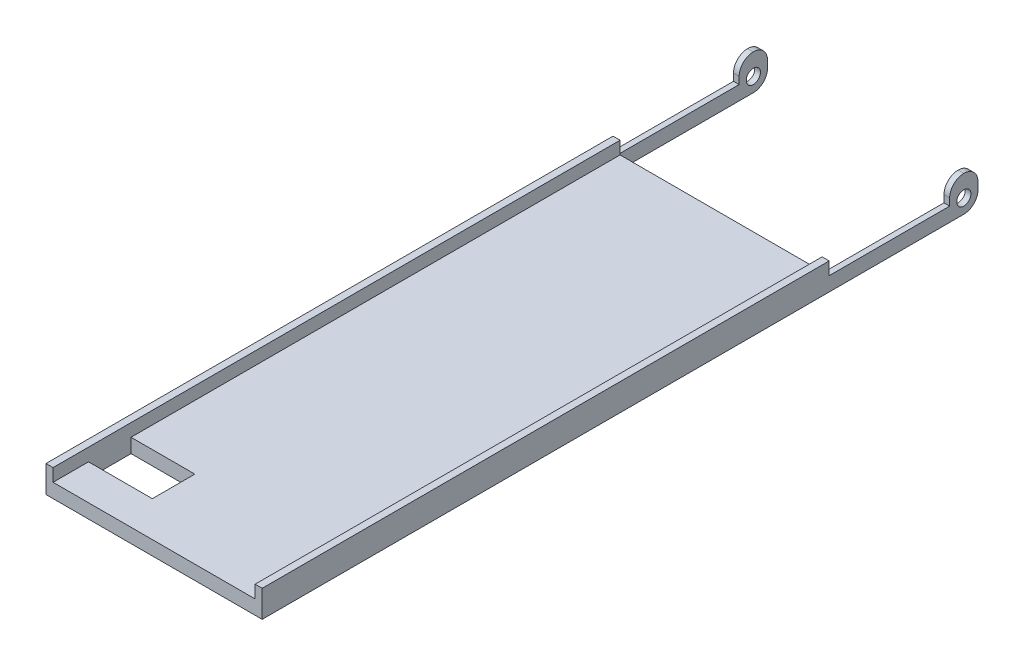
ISO-10303-21;
HEADER;
FILE_DESCRIPTION(('STEP AP214'),'2;1');
FILE_NAME('part.step','',(''),(''),'','','');
FILE_SCHEMA(('AUTOMOTIVE_DESIGN { 1 0 10303 214 1 1 1 1 }'));
ENDSEC;
DATA;
#1=APPLICATION_CONTEXT('core data for automotive mechanical design processes');
#2=APPLICATION_PROTOCOL_DEFINITION('international standard','automotive_design',2000,#1);
#3=PRODUCT_CONTEXT('',#1,'mechanical');
#4=PRODUCT('Part','Part','',(#3));
#5=PRODUCT_RELATED_PRODUCT_CATEGORY('part','',(#4));
#6=PRODUCT_DEFINITION_FORMATION('','',#4);
#7=PRODUCT_DEFINITION_CONTEXT('part definition',#1,'design');
#8=PRODUCT_DEFINITION('design','',#6,#7);
#9=PRODUCT_DEFINITION_SHAPE('','',#8);
#10=(LENGTH_UNIT() NAMED_UNIT(*) SI_UNIT(.MILLI.,.METRE.));
#11=(NAMED_UNIT(*) PLANE_ANGLE_UNIT() SI_UNIT($,.RADIAN.));
#12=(NAMED_UNIT(*) SI_UNIT($,.STERADIAN.) SOLID_ANGLE_UNIT());
#13=UNCERTAINTY_MEASURE_WITH_UNIT(LENGTH_MEASURE(1.E-05),#10,'distance_accuracy_value','');
#14=(GEOMETRIC_REPRESENTATION_CONTEXT(3) GLOBAL_UNCERTAINTY_ASSIGNED_CONTEXT((#13)) GLOBAL_UNIT_ASSIGNED_CONTEXT((#10,
#11,#12)) REPRESENTATION_CONTEXT('',''));
#15=CARTESIAN_POINT('',(0.,0.,0.));
#16=DIRECTION('',(0.,0.,1.));
#17=DIRECTION('',(1.,0.,0.));
#18=AXIS2_PLACEMENT_3D('',#15,#16,#17);
#19=CARTESIAN_POINT('',(0.,2.,0.));
#20=DIRECTION('',(0.,1.,0.));
#21=DIRECTION('',(0.,0.,1.));
#22=AXIS2_PLACEMENT_3D('',#19,#20,#21);
#23=PLANE('',#22);
#24=DIRECTION('',(0.,0.,-1.));
#25=VECTOR('',#24,1.);
#26=CARTESIAN_POINT('',(14.45,2.,-42.5));
#27=LINE('',#26,#25);
#28=CARTESIAN_POINT('',(14.45,2.,-21.5));
#29=VERTEX_POINT('',#28);
#30=CARTESIAN_POINT('',(14.45,2.,-38.5));
#31=VERTEX_POINT('',#30);
#32=EDGE_CURVE('E396',#29,#31,#27,.T.);
#33=ORIENTED_EDGE('',*,*,#32,.F.);
#34=DIRECTION('',(-1.,0.,0.));
#35=VECTOR('',#34,1.);
#36=CARTESIAN_POINT('',(15.25,2.,-21.5));
#37=LINE('',#36,#35);
#38=CARTESIAN_POINT('',(15.25,2.,-21.5));
#39=VERTEX_POINT('',#38);
#40=EDGE_CURVE('E321',#39,#29,#37,.T.);
#41=ORIENTED_EDGE('',*,*,#40,.F.);
#42=DIRECTION('',(0.,0.,-1.));
#43=VECTOR('',#42,1.);
#44=CARTESIAN_POINT('',(15.25,2.,42.5));
#45=LINE('',#44,#43);
#46=CARTESIAN_POINT('',(15.25,2.,-38.5));
#47=VERTEX_POINT('',#46);
#48=EDGE_CURVE('E419',#39,#47,#45,.T.);
#49=ORIENTED_EDGE('',*,*,#48,.T.);
#50=DIRECTION('',(1.,0.,0.));
#51=VECTOR('',#50,1.);
#52=CARTESIAN_POINT('',(14.45,2.,-38.5));
#53=LINE('',#52,#51);
#54=EDGE_CURVE('E361',#31,#47,#53,.T.);
#55=ORIENTED_EDGE('',*,*,#54,.F.);
#56=EDGE_LOOP('',(#33,#41,#49,#55));
#57=FACE_BOUND('',#56,.T.);
#58=ADVANCED_FACE('F45',(#57),#23,.T.);
#59=DIRECTION('',(-1.,0.,0.));
#60=VECTOR('',#59,1.);
#61=CARTESIAN_POINT('',(-14.25,2.,47.5));
#62=LINE('',#61,#60);
#63=CARTESIAN_POINT('',(-5.24999999999999,2.,47.5));
#64=VERTEX_POINT('',#63);
#65=CARTESIAN_POINT('',(-14.25,2.,47.5));
#66=VERTEX_POINT('',#65);
#67=EDGE_CURVE('E70',#64,#66,#62,.T.);
#68=ORIENTED_EDGE('',*,*,#67,.F.);
#69=DIRECTION('',(0.,0.,-1.));
#70=VECTOR('',#69,1.);
#71=CARTESIAN_POINT('',(-5.24999999999999,2.,53.5));
#72=LINE('',#71,#70);
#73=CARTESIAN_POINT('',(-5.24999999999999,2.,53.5));
#74=VERTEX_POINT('',#73);
#75=EDGE_CURVE('E247',#74,#64,#72,.T.);
#76=ORIENTED_EDGE('',*,*,#75,.F.);
#77=DIRECTION('',(1.,0.,0.));
#78=VECTOR('',#77,1.);
#79=CARTESIAN_POINT('',(-14.25,2.,53.5));
#80=LINE('',#79,#78);
#81=CARTESIAN_POINT('',(-14.25,2.,53.5));
#82=VERTEX_POINT('',#81);
#83=EDGE_CURVE('E254',#82,#74,#80,.T.);
#84=ORIENTED_EDGE('',*,*,#83,.F.);
#85=DIRECTION('',(0.,0.,1.));
#86=VECTOR('',#85,1.);
#87=CARTESIAN_POINT('',(-14.25,2.,-21.5));
#88=LINE('',#87,#86);
#89=CARTESIAN_POINT('',(-14.25,2.,58.5));
#90=VERTEX_POINT('',#89);
#91=EDGE_CURVE('E227',#82,#90,#88,.T.);
#92=ORIENTED_EDGE('',*,*,#91,.T.);
#93=DIRECTION('',(1.,0.,0.));
#94=VECTOR('',#93,1.);
#95=CARTESIAN_POINT('',(-14.25,2.,58.5));
#96=LINE('',#95,#94);
#97=CARTESIAN_POINT('',(14.25,2.,58.5));
#98=VERTEX_POINT('',#97);
#99=EDGE_CURVE('E288',#90,#98,#96,.T.);
#100=ORIENTED_EDGE('',*,*,#99,.T.);
#101=DIRECTION('',(0.,0.,-1.));
#102=VECTOR('',#101,1.);
#103=CARTESIAN_POINT('',(14.25,2.,-21.5));
#104=LINE('',#103,#102);
#105=CARTESIAN_POINT('',(14.25,2.,-21.5));
#106=VERTEX_POINT('',#105);
#107=EDGE_CURVE('E292',#98,#106,#104,.T.);
#108=ORIENTED_EDGE('',*,*,#107,.T.);
#109=DIRECTION('',(1.,0.,0.));
#110=VECTOR('',#109,1.);
#111=CARTESIAN_POINT('',(14.45,2.,-21.5));
#112=LINE('',#111,#110);
#113=CARTESIAN_POINT('',(-14.25,2.,-21.5));
#114=VERTEX_POINT('',#113);
#115=EDGE_CURVE('E280',#114,#106,#112,.T.);
#116=ORIENTED_EDGE('',*,*,#115,.F.);
#117=EDGE_CURVE('E284',#114,#66,#88,.T.);
#118=ORIENTED_EDGE('',*,*,#117,.T.);
#119=EDGE_LOOP('',(#68,#76,#84,#92,#100,#108,#116,#118));
#120=FACE_BOUND('',#119,.T.);
#121=ADVANCED_FACE('F591',(#120),#23,.T.);
#122=CARTESIAN_POINT('',(0.,3.8,0.));
#123=DIRECTION('',(0.,1.,0.));
#124=DIRECTION('',(0.,0.,1.));
#125=AXIS2_PLACEMENT_3D('',#122,#123,#124);
#126=PLANE('',#125);
#127=DIRECTION('',(0.,0.,1.));
#128=VECTOR('',#127,1.);
#129=CARTESIAN_POINT('',(-14.25,3.8,-21.5));
#130=LINE('',#129,#128);
#131=CARTESIAN_POINT('',(-14.25,3.8,-21.5));
#132=VERTEX_POINT('',#131);
#133=CARTESIAN_POINT('',(-14.25,3.8,58.5));
#134=VERTEX_POINT('',#133);
#135=EDGE_CURVE('E283',#132,#134,#130,.T.);
#136=ORIENTED_EDGE('',*,*,#135,.F.);
#137=DIRECTION('',(-1.,0.,0.));
#138=VECTOR('',#137,1.);
#139=CARTESIAN_POINT('',(15.25,3.8,-21.5));
#140=LINE('',#139,#138);
#141=CARTESIAN_POINT('',(-15.25,3.8,-21.5));
#142=VERTEX_POINT('',#141);
#143=EDGE_CURVE('E320',#132,#142,#140,.T.);
#144=ORIENTED_EDGE('',*,*,#143,.T.);
#145=DIRECTION('',(0.,0.,1.));
#146=VECTOR('',#145,1.);
#147=CARTESIAN_POINT('',(-15.25,3.8,58.5));
#148=LINE('',#147,#146);
#149=CARTESIAN_POINT('',(-15.25,3.8,58.5));
#150=VERTEX_POINT('',#149);
#151=EDGE_CURVE('E326',#142,#150,#148,.T.);
#152=ORIENTED_EDGE('',*,*,#151,.T.);
#153=DIRECTION('',(1.,0.,0.));
#154=VECTOR('',#153,1.);
#155=CARTESIAN_POINT('',(15.25,3.8,58.5));
#156=LINE('',#155,#154);
#157=EDGE_CURVE('E331',#150,#134,#156,.T.);
#158=ORIENTED_EDGE('',*,*,#157,.T.);
#159=EDGE_LOOP('',(#136,#144,#152,#158));
#160=FACE_BOUND('',#159,.T.);
#161=ADVANCED_FACE('F602',(#160),#126,.T.);
#162=CARTESIAN_POINT('',(-14.45,2.,-21.5));
#163=VERTEX_POINT('',#162);
#164=CARTESIAN_POINT('',(-15.25,2.,-21.5));
#165=VERTEX_POINT('',#164);
#166=EDGE_CURVE('E305',#163,#165,#37,.T.);
#167=ORIENTED_EDGE('',*,*,#166,.F.);
#168=DIRECTION('',(0.,0.,1.));
#169=VECTOR('',#168,1.);
#170=CARTESIAN_POINT('',(-14.45,2.,-24.5));
#171=LINE('',#170,#169);
#172=CARTESIAN_POINT('',(-14.45,2.,-38.5));
#173=VERTEX_POINT('',#172);
#174=EDGE_CURVE('E402',#173,#163,#171,.T.);
#175=ORIENTED_EDGE('',*,*,#174,.F.);
#176=DIRECTION('',(-1.,0.,0.));
#177=VECTOR('',#176,1.);
#178=CARTESIAN_POINT('',(-14.45,2.,-38.5));
#179=LINE('',#178,#177);
#180=CARTESIAN_POINT('',(-15.25,2.,-38.5));
#181=VERTEX_POINT('',#180);
#182=EDGE_CURVE('E382',#173,#181,#179,.T.);
#183=ORIENTED_EDGE('',*,*,#182,.T.);
#184=DIRECTION('',(0.,0.,-1.));
#185=VECTOR('',#184,1.);
#186=CARTESIAN_POINT('',(-15.25,2.,42.5));
#187=LINE('',#186,#185);
#188=EDGE_CURVE('E422',#165,#181,#187,.T.);
#189=ORIENTED_EDGE('',*,*,#188,.F.);
#190=EDGE_LOOP('',(#167,#175,#183,#189));
#191=FACE_BOUND('',#190,.T.);
#192=ADVANCED_FACE('F585',(#191),#23,.T.);
#193=CARTESIAN_POINT('',(-15.25,2.,-42.5));
#194=DIRECTION('',(0.,0.,-1.));
#195=DIRECTION('',(-1.,0.,0.));
#196=AXIS2_PLACEMENT_3D('',#193,#194,#195);
#197=PLANE('',#196);
#198=DIRECTION('',(0.,1.,0.));
#199=VECTOR('',#198,1.);
#200=CARTESIAN_POINT('',(-14.45,0.,-42.5));
#201=LINE('',#200,#199);
#202=CARTESIAN_POINT('',(-14.45,2.,-42.5));
#203=VERTEX_POINT('',#202);
#204=CARTESIAN_POINT('',(-14.45,3.,-42.5));
#205=VERTEX_POINT('',#204);
#206=EDGE_CURVE('E411',#203,#205,#201,.T.);
#207=ORIENTED_EDGE('',*,*,#206,.F.);
#208=DIRECTION('',(1.,0.,0.));
#209=VECTOR('',#208,1.);
#210=CARTESIAN_POINT('',(-15.25,2.,-42.5));
#211=LINE('',#210,#209);
#212=CARTESIAN_POINT('',(-15.25,2.,-42.5));
#213=VERTEX_POINT('',#212);
#214=EDGE_CURVE('E457',#203,#213,#211,.F.);
#215=ORIENTED_EDGE('',*,*,#214,.T.);
#216=DIRECTION('',(0.,-1.,0.));
#217=VECTOR('',#216,1.);
#218=CARTESIAN_POINT('',(-15.25,2.,-42.5));
#219=LINE('',#218,#217);
#220=CARTESIAN_POINT('',(-15.25,3.,-42.5));
#221=VERTEX_POINT('',#220);
#222=EDGE_CURVE('E426',#221,#213,#219,.T.);
#223=ORIENTED_EDGE('',*,*,#222,.F.);
#224=DIRECTION('',(-1.,0.,0.));
#225=VECTOR('',#224,1.);
#226=CARTESIAN_POINT('',(-15.25,3.,-42.5));
#227=LINE('',#226,#225);
#228=EDGE_CURVE('E453',#221,#205,#227,.F.);
#229=ORIENTED_EDGE('',*,*,#228,.T.);
#230=EDGE_LOOP('',(#207,#215,#223,#229));
#231=FACE_BOUND('',#230,.T.);
#232=ADVANCED_FACE('F562',(#231),#197,.T.);
#233=CARTESIAN_POINT('',(15.25,2.,42.5));
#234=DIRECTION('',(-1.,0.,0.));
#235=DIRECTION('',(0.,0.,1.));
#236=AXIS2_PLACEMENT_3D('',#233,#234,#235);
#237=PLANE('',#236);
#238=CARTESIAN_POINT('',(15.25,2.,-40.5));
#239=DIRECTION('',(-1.,0.,0.));
#240=DIRECTION('',(0.,0.,1.));
#241=AXIS2_PLACEMENT_3D('',#238,#239,#240);
#242=CIRCLE('',#241,0.999999999999998);
#243=CARTESIAN_POINT('',(15.25,2.,-39.5));
#244=VERTEX_POINT('',#243);
#245=EDGE_CURVE('E362',#244,#244,#242,.T.);
#246=ORIENTED_EDGE('',*,*,#245,.T.);
#247=EDGE_LOOP('',(#246));
#248=FACE_BOUND('',#247,.T.);
#249=DIRECTION('',(0.,0.,-1.));
#250=VECTOR('',#249,1.);
#251=CARTESIAN_POINT('',(15.25,0.,42.5));
#252=LINE('',#251,#250);
#253=CARTESIAN_POINT('',(15.25,0.,58.5));
#254=VERTEX_POINT('',#253);
#255=CARTESIAN_POINT('',(15.25,0.,-40.5));
#256=VERTEX_POINT('',#255);
#257=EDGE_CURVE('E415',#254,#256,#252,.T.);
#258=ORIENTED_EDGE('',*,*,#257,.T.);
#259=CARTESIAN_POINT('',(15.25,2.,-40.5));
#260=DIRECTION('',(-1.,0.,0.));
#261=DIRECTION('',(0.,0.,1.));
#262=AXIS2_PLACEMENT_3D('',#259,#260,#261);
#263=CIRCLE('',#262,2.);
#264=CARTESIAN_POINT('',(15.25,2.,-42.5));
#265=VERTEX_POINT('',#264);
#266=EDGE_CURVE('E485',#256,#265,#263,.F.);
#267=ORIENTED_EDGE('',*,*,#266,.T.);
#268=DIRECTION('',(0.,-1.,0.));
#269=VECTOR('',#268,1.);
#270=CARTESIAN_POINT('',(15.25,2.,-42.5));
#271=LINE('',#270,#269);
#272=CARTESIAN_POINT('',(15.25,3.,-42.5));
#273=VERTEX_POINT('',#272);
#274=EDGE_CURVE('E436',#273,#265,#271,.T.);
#275=ORIENTED_EDGE('',*,*,#274,.F.);
#276=CARTESIAN_POINT('',(15.25,3.,-40.5));
#277=DIRECTION('',(-1.,0.,0.));
#278=DIRECTION('',(0.,0.,1.));
#279=AXIS2_PLACEMENT_3D('',#276,#277,#278);
#280=CIRCLE('',#279,2.);
#281=CARTESIAN_POINT('',(15.25,5.,-40.5));
#282=VERTEX_POINT('',#281);
#283=EDGE_CURVE('E479',#273,#282,#280,.F.);
#284=ORIENTED_EDGE('',*,*,#283,.T.);
#285=CARTESIAN_POINT('',(15.25,3.,-40.5));
#286=DIRECTION('',(-1.,0.,0.));
#287=DIRECTION('',(0.,0.,1.));
#288=AXIS2_PLACEMENT_3D('',#285,#286,#287);
#289=CIRCLE('',#288,2.);
#290=CARTESIAN_POINT('',(15.25,3.,-38.5));
#291=VERTEX_POINT('',#290);
#292=EDGE_CURVE('E482',#282,#291,#289,.F.);
#293=ORIENTED_EDGE('',*,*,#292,.T.);
#294=DIRECTION('',(0.,-1.,0.));
#295=VECTOR('',#294,1.);
#296=CARTESIAN_POINT('',(15.25,5.,-38.5));
#297=LINE('',#296,#295);
#298=EDGE_CURVE('E370',#291,#47,#297,.T.);
#299=ORIENTED_EDGE('',*,*,#298,.T.);
#300=ORIENTED_EDGE('',*,*,#48,.F.);
#301=DIRECTION('',(0.,-1.,0.));
#302=VECTOR('',#301,1.);
#303=CARTESIAN_POINT('',(15.25,3.8,-21.5));
#304=LINE('',#303,#302);
#305=CARTESIAN_POINT('',(15.25,3.8,-21.5));
#306=VERTEX_POINT('',#305);
#307=EDGE_CURVE('E342',#306,#39,#304,.T.);
#308=ORIENTED_EDGE('',*,*,#307,.F.);
#309=DIRECTION('',(0.,0.,-1.));
#310=VECTOR('',#309,1.);
#311=CARTESIAN_POINT('',(15.25,3.8,58.5));
#312=LINE('',#311,#310);
#313=CARTESIAN_POINT('',(15.25,3.8,58.5));
#314=VERTEX_POINT('',#313);
#315=EDGE_CURVE('E316',#314,#306,#312,.T.);
#316=ORIENTED_EDGE('',*,*,#315,.F.);
#317=DIRECTION('',(0.,1.,0.));
#318=VECTOR('',#317,1.);
#319=CARTESIAN_POINT('',(15.25,2.,58.5));
#320=LINE('',#319,#318);
#321=EDGE_CURVE('E353',#254,#314,#320,.T.);
#322=ORIENTED_EDGE('',*,*,#321,.F.);
#323=EDGE_LOOP('',(#258,#267,#275,#284,#293,#299,#300,#308,#316,#322));
#324=FACE_BOUND('',#323,.T.);
#325=ADVANCED_FACE('F513',(#248,#324),#237,.F.);
#326=ORIENTED_EDGE('',*,*,#274,.T.);
#327=DIRECTION('',(1.,0.,0.));
#328=VECTOR('',#327,1.);
#329=CARTESIAN_POINT('',(14.45,2.,-42.5));
#330=LINE('',#329,#328);
#331=CARTESIAN_POINT('',(14.45,2.,-42.5));
#332=VERTEX_POINT('',#331);
#333=EDGE_CURVE('E491',#265,#332,#330,.F.);
#334=ORIENTED_EDGE('',*,*,#333,.T.);
#335=DIRECTION('',(0.,1.,0.));
#336=VECTOR('',#335,1.);
#337=CARTESIAN_POINT('',(14.45,0.,-42.5));
#338=LINE('',#337,#336);
#339=CARTESIAN_POINT('',(14.45,3.,-42.5));
#340=VERTEX_POINT('',#339);
#341=EDGE_CURVE('E405',#332,#340,#338,.T.);
#342=ORIENTED_EDGE('',*,*,#341,.T.);
#343=DIRECTION('',(1.,0.,0.));
#344=VECTOR('',#343,1.);
#345=CARTESIAN_POINT('',(-15.25,3.,-42.5));
#346=LINE('',#345,#344);
#347=EDGE_CURVE('E488',#340,#273,#346,.T.);
#348=ORIENTED_EDGE('',*,*,#347,.T.);
#349=EDGE_LOOP('',(#326,#334,#342,#348));
#350=FACE_BOUND('',#349,.T.);
#351=ADVANCED_FACE('F517',(#350),#197,.T.);
#352=CARTESIAN_POINT('',(-15.25,2.,42.5));
#353=DIRECTION('',(-1.,0.,0.));
#354=DIRECTION('',(0.,0.,1.));
#355=AXIS2_PLACEMENT_3D('',#352,#353,#354);
#356=PLANE('',#355);
#357=CARTESIAN_POINT('',(-15.25,2.,-40.5));
#358=DIRECTION('',(-1.,0.,0.));
#359=DIRECTION('',(0.,0.,1.));
#360=AXIS2_PLACEMENT_3D('',#357,#358,#359);
#361=CIRCLE('',#360,0.999999999999998);
#362=CARTESIAN_POINT('',(-15.25,2.,-39.5));
#363=VERTEX_POINT('',#362);
#364=EDGE_CURVE('E377',#363,#363,#361,.T.);
#365=ORIENTED_EDGE('',*,*,#364,.F.);
#366=EDGE_LOOP('',(#365));
#367=FACE_BOUND('',#366,.T.);
#368=ORIENTED_EDGE('',*,*,#222,.T.);
#369=CARTESIAN_POINT('',(-15.25,2.,-40.5));
#370=DIRECTION('',(-1.,0.,0.));
#371=DIRECTION('',(0.,0.,1.));
#372=AXIS2_PLACEMENT_3D('',#369,#370,#371);
#373=CIRCLE('',#372,2.);
#374=CARTESIAN_POINT('',(-15.25,0.,-40.5));
#375=VERTEX_POINT('',#374);
#376=EDGE_CURVE('E466',#213,#375,#373,.T.);
#377=ORIENTED_EDGE('',*,*,#376,.T.);
#378=DIRECTION('',(0.,0.,-1.));
#379=VECTOR('',#378,1.);
#380=CARTESIAN_POINT('',(-15.25,0.,42.5));
#381=LINE('',#380,#379);
#382=CARTESIAN_POINT('',(-15.25,0.,58.5));
#383=VERTEX_POINT('',#382);
#384=EDGE_CURVE('E423',#383,#375,#381,.T.);
#385=ORIENTED_EDGE('',*,*,#384,.F.);
#386=DIRECTION('',(0.,-1.,0.));
#387=VECTOR('',#386,1.);
#388=CARTESIAN_POINT('',(-15.25,2.,58.5));
#389=LINE('',#388,#387);
#390=EDGE_CURVE('E345',#150,#383,#389,.T.);
#391=ORIENTED_EDGE('',*,*,#390,.F.);
#392=ORIENTED_EDGE('',*,*,#151,.F.);
#393=DIRECTION('',(0.,-1.,0.));
#394=VECTOR('',#393,1.);
#395=CARTESIAN_POINT('',(-15.25,3.8,-21.5));
#396=LINE('',#395,#394);
#397=EDGE_CURVE('E335',#142,#165,#396,.T.);
#398=ORIENTED_EDGE('',*,*,#397,.T.);
#399=ORIENTED_EDGE('',*,*,#188,.T.);
#400=DIRECTION('',(0.,-1.,0.));
#401=VECTOR('',#400,1.);
#402=CARTESIAN_POINT('',(-15.25,5.,-38.5));
#403=LINE('',#402,#401);
#404=CARTESIAN_POINT('',(-15.25,3.,-38.5));
#405=VERTEX_POINT('',#404);
#406=EDGE_CURVE('E392',#405,#181,#403,.T.);
#407=ORIENTED_EDGE('',*,*,#406,.F.);
#408=CARTESIAN_POINT('',(-15.25,3.,-40.5));
#409=DIRECTION('',(-1.,0.,0.));
#410=DIRECTION('',(0.,0.,1.));
#411=AXIS2_PLACEMENT_3D('',#408,#409,#410);
#412=CIRCLE('',#411,2.);
#413=CARTESIAN_POINT('',(-15.25,5.,-40.5));
#414=VERTEX_POINT('',#413);
#415=EDGE_CURVE('E460',#405,#414,#412,.T.);
#416=ORIENTED_EDGE('',*,*,#415,.T.);
#417=CARTESIAN_POINT('',(-15.25,3.,-40.5));
#418=DIRECTION('',(-1.,0.,0.));
#419=DIRECTION('',(0.,0.,1.));
#420=AXIS2_PLACEMENT_3D('',#417,#418,#419);
#421=CIRCLE('',#420,2.);
#422=EDGE_CURVE('E463',#414,#221,#421,.T.);
#423=ORIENTED_EDGE('',*,*,#422,.T.);
#424=EDGE_LOOP('',(#368,#377,#385,#391,#392,#398,#399,#407,#416,#423));
#425=FACE_BOUND('',#424,.T.);
#426=ADVANCED_FACE('F579',(#367,#425),#356,.T.);
#427=CARTESIAN_POINT('',(0.,0.,0.));
#428=DIRECTION('',(0.,1.,0.));
#429=DIRECTION('',(0.,0.,1.));
#430=AXIS2_PLACEMENT_3D('',#427,#428,#429);
#431=PLANE('',#430);
#432=DIRECTION('',(-1.,0.,0.));
#433=VECTOR('',#432,1.);
#434=CARTESIAN_POINT('',(-14.25,0.,47.5));
#435=LINE('',#434,#433);
#436=CARTESIAN_POINT('',(-5.24999999999999,0.,47.5));
#437=VERTEX_POINT('',#436);
#438=CARTESIAN_POINT('',(-14.25,0.,47.5));
#439=VERTEX_POINT('',#438);
#440=EDGE_CURVE('E233',#437,#439,#435,.T.);
#441=ORIENTED_EDGE('',*,*,#440,.T.);
#442=DIRECTION('',(0.,0.,1.));
#443=VECTOR('',#442,1.);
#444=CARTESIAN_POINT('',(-14.25,0.,53.5));
#445=LINE('',#444,#443);
#446=CARTESIAN_POINT('',(-14.25,0.,53.5));
#447=VERTEX_POINT('',#446);
#448=EDGE_CURVE('E224',#439,#447,#445,.T.);
#449=ORIENTED_EDGE('',*,*,#448,.T.);
#450=DIRECTION('',(1.,0.,0.));
#451=VECTOR('',#450,1.);
#452=CARTESIAN_POINT('',(-14.25,0.,53.5));
#453=LINE('',#452,#451);
#454=CARTESIAN_POINT('',(-5.24999999999999,0.,53.5));
#455=VERTEX_POINT('',#454);
#456=EDGE_CURVE('E236',#447,#455,#453,.T.);
#457=ORIENTED_EDGE('',*,*,#456,.T.);
#458=DIRECTION('',(0.,0.,-1.));
#459=VECTOR('',#458,1.);
#460=CARTESIAN_POINT('',(-5.24999999999999,0.,53.5));
#461=LINE('',#460,#459);
#462=EDGE_CURVE('E62',#455,#437,#461,.T.);
#463=ORIENTED_EDGE('',*,*,#462,.T.);
#464=EDGE_LOOP('',(#441,#449,#457,#463));
#465=FACE_BOUND('',#464,.T.);
#466=DIRECTION('',(-1.,0.,0.));
#467=VECTOR('',#466,1.);
#468=CARTESIAN_POINT('',(14.45,0.,-21.5));
#469=LINE('',#468,#467);
#470=CARTESIAN_POINT('',(14.45,0.,-21.5));
#471=VERTEX_POINT('',#470);
#472=CARTESIAN_POINT('',(-14.45,0.,-21.5));
#473=VERTEX_POINT('',#472);
#474=EDGE_CURVE('E272',#471,#473,#469,.T.);
#475=ORIENTED_EDGE('',*,*,#474,.F.);
#476=DIRECTION('',(0.,0.,-1.));
#477=VECTOR('',#476,1.);
#478=CARTESIAN_POINT('',(14.45,0.,-24.5));
#479=LINE('',#478,#477);
#480=CARTESIAN_POINT('',(14.45,0.,-40.5));
#481=VERTEX_POINT('',#480);
#482=EDGE_CURVE('E397',#471,#481,#479,.T.);
#483=ORIENTED_EDGE('',*,*,#482,.T.);
#484=DIRECTION('',(1.,0.,0.));
#485=VECTOR('',#484,1.);
#486=CARTESIAN_POINT('',(15.25,0.,-40.5));
#487=LINE('',#486,#485);
#488=EDGE_CURVE('E472',#481,#256,#487,.T.);
#489=ORIENTED_EDGE('',*,*,#488,.T.);
#490=ORIENTED_EDGE('',*,*,#257,.F.);
#491=DIRECTION('',(1.,0.,0.));
#492=VECTOR('',#491,1.);
#493=CARTESIAN_POINT('',(-15.25,0.,58.5));
#494=LINE('',#493,#492);
#495=EDGE_CURVE('E349',#383,#254,#494,.T.);
#496=ORIENTED_EDGE('',*,*,#495,.F.);
#497=ORIENTED_EDGE('',*,*,#384,.T.);
#498=DIRECTION('',(1.,0.,0.));
#499=VECTOR('',#498,1.);
#500=CARTESIAN_POINT('',(-14.45,0.,-40.5));
#501=LINE('',#500,#499);
#502=CARTESIAN_POINT('',(-14.45,0.,-40.5));
#503=VERTEX_POINT('',#502);
#504=EDGE_CURVE('E440',#375,#503,#501,.T.);
#505=ORIENTED_EDGE('',*,*,#504,.T.);
#506=DIRECTION('',(0.,0.,1.));
#507=VECTOR('',#506,1.);
#508=CARTESIAN_POINT('',(-14.45,0.,-42.5));
#509=LINE('',#508,#507);
#510=EDGE_CURVE('E401',#503,#473,#509,.T.);
#511=ORIENTED_EDGE('',*,*,#510,.T.);
#512=EDGE_LOOP('',(#475,#483,#489,#490,#496,#497,#505,#511));
#513=FACE_BOUND('',#512,.T.);
#514=ADVANCED_FACE('F241',(#465,#513),#431,.F.);
#515=CARTESIAN_POINT('',(-14.45,0.,-24.5));
#516=DIRECTION('',(-1.,0.,0.));
#517=DIRECTION('',(0.,0.,1.));
#518=AXIS2_PLACEMENT_3D('',#515,#516,#517);
#519=PLANE('',#518);
#520=CARTESIAN_POINT('',(-14.45,2.,-40.5));
#521=DIRECTION('',(-1.,0.,0.));
#522=DIRECTION('',(0.,0.,1.));
#523=AXIS2_PLACEMENT_3D('',#520,#521,#522);
#524=CIRCLE('',#523,0.999999999999998);
#525=CARTESIAN_POINT('',(-14.45,2.,-39.5));
#526=VERTEX_POINT('',#525);
#527=EDGE_CURVE('E378',#526,#526,#524,.T.);
#528=ORIENTED_EDGE('',*,*,#527,.T.);
#529=EDGE_LOOP('',(#528));
#530=FACE_BOUND('',#529,.T.);
#531=ORIENTED_EDGE('',*,*,#510,.F.);
#532=CARTESIAN_POINT('',(-14.45,2.,-40.5));
#533=DIRECTION('',(-1.,0.,0.));
#534=DIRECTION('',(0.,0.,1.));
#535=AXIS2_PLACEMENT_3D('',#532,#533,#534);
#536=CIRCLE('',#535,2.);
#537=EDGE_CURVE('E450',#503,#203,#536,.F.);
#538=ORIENTED_EDGE('',*,*,#537,.T.);
#539=ORIENTED_EDGE('',*,*,#206,.T.);
#540=CARTESIAN_POINT('',(-14.45,3.,-40.5));
#541=DIRECTION('',(-1.,0.,0.));
#542=DIRECTION('',(0.,0.,1.));
#543=AXIS2_PLACEMENT_3D('',#540,#541,#542);
#544=CIRCLE('',#543,2.);
#545=CARTESIAN_POINT('',(-14.45,5.,-40.5));
#546=VERTEX_POINT('',#545);
#547=EDGE_CURVE('E447',#205,#546,#544,.F.);
#548=ORIENTED_EDGE('',*,*,#547,.T.);
#549=CARTESIAN_POINT('',(-14.45,3.,-40.5));
#550=DIRECTION('',(-1.,0.,0.));
#551=DIRECTION('',(0.,0.,1.));
#552=AXIS2_PLACEMENT_3D('',#549,#550,#551);
#553=CIRCLE('',#552,2.);
#554=CARTESIAN_POINT('',(-14.45,3.,-38.5));
#555=VERTEX_POINT('',#554);
#556=EDGE_CURVE('E444',#546,#555,#553,.F.);
#557=ORIENTED_EDGE('',*,*,#556,.T.);
#558=DIRECTION('',(0.,-1.,0.));
#559=VECTOR('',#558,1.);
#560=CARTESIAN_POINT('',(-14.45,5.,-38.5));
#561=LINE('',#560,#559);
#562=EDGE_CURVE('E389',#555,#173,#561,.T.);
#563=ORIENTED_EDGE('',*,*,#562,.T.);
#564=ORIENTED_EDGE('',*,*,#174,.T.);
#565=DIRECTION('',(0.,1.,0.));
#566=VECTOR('',#565,1.);
#567=CARTESIAN_POINT('',(-14.45,2.,-21.5));
#568=LINE('',#567,#566);
#569=EDGE_CURVE('E276',#473,#163,#568,.T.);
#570=ORIENTED_EDGE('',*,*,#569,.F.);
#571=EDGE_LOOP('',(#531,#538,#539,#548,#557,#563,#564,#570));
#572=FACE_BOUND('',#571,.T.);
#573=ADVANCED_FACE('F559',(#530,#572),#519,.F.);
#574=CARTESIAN_POINT('',(14.45,0.,-42.5));
#575=DIRECTION('',(1.,0.,0.));
#576=DIRECTION('',(0.,0.,-1.));
#577=AXIS2_PLACEMENT_3D('',#574,#575,#576);
#578=PLANE('',#577);
#579=CARTESIAN_POINT('',(14.45,2.,-40.5));
#580=DIRECTION('',(-1.,0.,0.));
#581=DIRECTION('',(0.,0.,1.));
#582=AXIS2_PLACEMENT_3D('',#579,#580,#581);
#583=CIRCLE('',#582,0.999999999999998);
#584=CARTESIAN_POINT('',(14.45,2.,-39.5));
#585=VERTEX_POINT('',#584);
#586=EDGE_CURVE('E357',#585,#585,#583,.T.);
#587=ORIENTED_EDGE('',*,*,#586,.F.);
#588=EDGE_LOOP('',(#587));
#589=FACE_BOUND('',#588,.T.);
#590=ORIENTED_EDGE('',*,*,#341,.F.);
#591=CARTESIAN_POINT('',(14.45,2.,-40.5));
#592=DIRECTION('',(1.,0.,0.));
#593=DIRECTION('',(0.,0.,-1.));
#594=AXIS2_PLACEMENT_3D('',#591,#592,#593);
#595=CIRCLE('',#594,2.);
#596=EDGE_CURVE('E55',#332,#481,#595,.F.);
#597=ORIENTED_EDGE('',*,*,#596,.T.);
#598=ORIENTED_EDGE('',*,*,#482,.F.);
#599=DIRECTION('',(0.,-1.,0.));
#600=VECTOR('',#599,1.);
#601=CARTESIAN_POINT('',(14.45,2.,-21.5));
#602=LINE('',#601,#600);
#603=EDGE_CURVE('E263',#29,#471,#602,.T.);
#604=ORIENTED_EDGE('',*,*,#603,.F.);
#605=ORIENTED_EDGE('',*,*,#32,.T.);
#606=DIRECTION('',(0.,-1.,0.));
#607=VECTOR('',#606,1.);
#608=CARTESIAN_POINT('',(14.45,5.,-38.5));
#609=LINE('',#608,#607);
#610=CARTESIAN_POINT('',(14.45,3.,-38.5));
#611=VERTEX_POINT('',#610);
#612=EDGE_CURVE('E374',#611,#31,#609,.T.);
#613=ORIENTED_EDGE('',*,*,#612,.F.);
#614=CARTESIAN_POINT('',(14.45,3.,-40.5));
#615=DIRECTION('',(1.,0.,0.));
#616=DIRECTION('',(0.,0.,-1.));
#617=AXIS2_PLACEMENT_3D('',#614,#615,#616);
#618=CIRCLE('',#617,2.);
#619=CARTESIAN_POINT('',(14.45,5.,-40.5));
#620=VERTEX_POINT('',#619);
#621=EDGE_CURVE('E497',#611,#620,#618,.F.);
#622=ORIENTED_EDGE('',*,*,#621,.T.);
#623=CARTESIAN_POINT('',(14.45,3.,-40.5));
#624=DIRECTION('',(1.,0.,0.));
#625=DIRECTION('',(0.,0.,-1.));
#626=AXIS2_PLACEMENT_3D('',#623,#624,#625);
#627=CIRCLE('',#626,2.);
#628=EDGE_CURVE('E494',#620,#340,#627,.F.);
#629=ORIENTED_EDGE('',*,*,#628,.T.);
#630=EDGE_LOOP('',(#590,#597,#598,#604,#605,#613,#622,#629));
#631=FACE_BOUND('',#630,.T.);
#632=ADVANCED_FACE('F504',(#589,#631),#578,.F.);
#633=CARTESIAN_POINT('',(-14.45,5.,-38.5));
#634=DIRECTION('',(0.,0.,1.));
#635=DIRECTION('',(1.,0.,0.));
#636=AXIS2_PLACEMENT_3D('',#633,#634,#635);
#637=PLANE('',#636);
#638=ORIENTED_EDGE('',*,*,#562,.F.);
#639=DIRECTION('',(-1.,0.,0.));
#640=VECTOR('',#639,1.);
#641=CARTESIAN_POINT('',(-14.45,3.,-38.5));
#642=LINE('',#641,#640);
#643=EDGE_CURVE('E469',#555,#405,#642,.T.);
#644=ORIENTED_EDGE('',*,*,#643,.T.);
#645=ORIENTED_EDGE('',*,*,#406,.T.);
#646=ORIENTED_EDGE('',*,*,#182,.F.);
#647=EDGE_LOOP('',(#638,#644,#645,#646));
#648=FACE_BOUND('',#647,.T.);
#649=ADVANCED_FACE('F577',(#648),#637,.T.);
#650=CARTESIAN_POINT('',(-14.45,2.,-40.5));
#651=DIRECTION('',(-1.,0.,0.));
#652=DIRECTION('',(0.,0.,1.));
#653=AXIS2_PLACEMENT_3D('',#650,#651,#652);
#654=CYLINDRICAL_SURFACE('',#653,0.999999999999998);
#655=ORIENTED_EDGE('',*,*,#527,.F.);
#656=EDGE_LOOP('',(#655));
#657=FACE_BOUND('',#656,.T.);
#658=ORIENTED_EDGE('',*,*,#364,.T.);
#659=EDGE_LOOP('',(#658));
#660=FACE_BOUND('',#659,.T.);
#661=ADVANCED_FACE('F657',(#657,#660),#654,.F.);
#662=CARTESIAN_POINT('',(14.45,5.,-38.5));
#663=DIRECTION('',(0.,0.,-1.));
#664=DIRECTION('',(-1.,0.,0.));
#665=AXIS2_PLACEMENT_3D('',#662,#663,#664);
#666=PLANE('',#665);
#667=ORIENTED_EDGE('',*,*,#298,.F.);
#668=DIRECTION('',(1.,0.,0.));
#669=VECTOR('',#668,1.);
#670=CARTESIAN_POINT('',(14.45,3.,-38.5));
#671=LINE('',#670,#669);
#672=EDGE_CURVE('E11',#291,#611,#671,.F.);
#673=ORIENTED_EDGE('',*,*,#672,.T.);
#674=ORIENTED_EDGE('',*,*,#612,.T.);
#675=ORIENTED_EDGE('',*,*,#54,.T.);
#676=EDGE_LOOP('',(#667,#673,#674,#675));
#677=FACE_BOUND('',#676,.T.);
#678=ADVANCED_FACE('F529',(#677),#666,.F.);
#679=CARTESIAN_POINT('',(14.45,2.,-40.5));
#680=DIRECTION('',(1.,0.,0.));
#681=DIRECTION('',(0.,0.,-1.));
#682=AXIS2_PLACEMENT_3D('',#679,#680,#681);
#683=CYLINDRICAL_SURFACE('',#682,0.999999999999998);
#684=ORIENTED_EDGE('',*,*,#586,.T.);
#685=EDGE_LOOP('',(#684));
#686=FACE_BOUND('',#685,.T.);
#687=ORIENTED_EDGE('',*,*,#245,.F.);
#688=EDGE_LOOP('',(#687));
#689=FACE_BOUND('',#688,.T.);
#690=ADVANCED_FACE('F632',(#686,#689),#683,.F.);
#691=CARTESIAN_POINT('',(0.,2.,-40.5));
#692=DIRECTION('',(-1.,0.,0.));
#693=DIRECTION('',(0.,0.,1.));
#694=AXIS2_PLACEMENT_3D('',#691,#692,#693);
#695=CYLINDRICAL_SURFACE('',#694,2.);
#696=ORIENTED_EDGE('',*,*,#376,.F.);
#697=ORIENTED_EDGE('',*,*,#214,.F.);
#698=ORIENTED_EDGE('',*,*,#537,.F.);
#699=ORIENTED_EDGE('',*,*,#504,.F.);
#700=EDGE_LOOP('',(#696,#697,#698,#699));
#701=FACE_BOUND('',#700,.T.);
#702=ADVANCED_FACE('F555',(#701),#695,.T.);
#703=CARTESIAN_POINT('',(-14.45,3.,-40.5));
#704=DIRECTION('',(-1.,0.,0.));
#705=DIRECTION('',(0.,0.,1.));
#706=AXIS2_PLACEMENT_3D('',#703,#704,#705);
#707=CYLINDRICAL_SURFACE('',#706,2.);
#708=ORIENTED_EDGE('',*,*,#643,.F.);
#709=ORIENTED_EDGE('',*,*,#556,.F.);
#710=DIRECTION('',(-1.,0.,0.));
#711=VECTOR('',#710,1.);
#712=CARTESIAN_POINT('',(3.51281503885302E-13,5.,-40.4999999999999));
#713=LINE('',#712,#711);
#714=EDGE_CURVE('E366',#414,#546,#713,.F.);
#715=ORIENTED_EDGE('',*,*,#714,.F.);
#716=ORIENTED_EDGE('',*,*,#415,.F.);
#717=EDGE_LOOP('',(#708,#709,#715,#716));
#718=FACE_BOUND('',#717,.T.);
#719=ADVANCED_FACE('F573',(#718),#707,.T.);
#720=CARTESIAN_POINT('',(0.,3.,-40.5));
#721=DIRECTION('',(-1.,0.,0.));
#722=DIRECTION('',(0.,0.,1.));
#723=AXIS2_PLACEMENT_3D('',#720,#721,#722);
#724=CYLINDRICAL_SURFACE('',#723,2.);
#725=ORIENTED_EDGE('',*,*,#547,.F.);
#726=ORIENTED_EDGE('',*,*,#228,.F.);
#727=ORIENTED_EDGE('',*,*,#422,.F.);
#728=ORIENTED_EDGE('',*,*,#714,.T.);
#729=EDGE_LOOP('',(#725,#726,#727,#728));
#730=FACE_BOUND('',#729,.T.);
#731=ADVANCED_FACE('F567',(#730),#724,.T.);
#732=CARTESIAN_POINT('',(0.,2.,-40.5));
#733=DIRECTION('',(-1.,0.,0.));
#734=DIRECTION('',(0.,0.,1.));
#735=AXIS2_PLACEMENT_3D('',#732,#733,#734);
#736=CYLINDRICAL_SURFACE('',#735,2.);
#737=ORIENTED_EDGE('',*,*,#596,.F.);
#738=ORIENTED_EDGE('',*,*,#333,.F.);
#739=ORIENTED_EDGE('',*,*,#266,.F.);
#740=ORIENTED_EDGE('',*,*,#488,.F.);
#741=EDGE_LOOP('',(#737,#738,#739,#740));
#742=FACE_BOUND('',#741,.T.);
#743=ADVANCED_FACE('F510',(#742),#736,.T.);
#744=CARTESIAN_POINT('',(-15.25,3.,-40.5));
#745=DIRECTION('',(1.,0.,0.));
#746=DIRECTION('',(0.,0.,-1.));
#747=AXIS2_PLACEMENT_3D('',#744,#745,#746);
#748=CYLINDRICAL_SURFACE('',#747,2.);
#749=ORIENTED_EDGE('',*,*,#347,.F.);
#750=ORIENTED_EDGE('',*,*,#628,.F.);
#751=DIRECTION('',(1.,0.,0.));
#752=VECTOR('',#751,1.);
#753=CARTESIAN_POINT('',(0.,5.,-40.5));
#754=LINE('',#753,#752);
#755=EDGE_CURVE('E49',#282,#620,#754,.F.);
#756=ORIENTED_EDGE('',*,*,#755,.F.);
#757=ORIENTED_EDGE('',*,*,#283,.F.);
#758=EDGE_LOOP('',(#749,#750,#756,#757));
#759=FACE_BOUND('',#758,.T.);
#760=ADVANCED_FACE('F47',(#759),#748,.T.);
#761=CARTESIAN_POINT('',(-3.51281503885302E-13,3.,-40.4999999999999));
#762=DIRECTION('',(-1.,0.,0.));
#763=DIRECTION('',(0.,0.,1.));
#764=AXIS2_PLACEMENT_3D('',#761,#762,#763);
#765=CYLINDRICAL_SURFACE('',#764,2.);
#766=ORIENTED_EDGE('',*,*,#621,.F.);
#767=ORIENTED_EDGE('',*,*,#672,.F.);
#768=ORIENTED_EDGE('',*,*,#292,.F.);
#769=ORIENTED_EDGE('',*,*,#755,.T.);
#770=EDGE_LOOP('',(#766,#767,#768,#769));
#771=FACE_BOUND('',#770,.T.);
#772=ADVANCED_FACE('F532',(#771),#765,.T.);
#773=CARTESIAN_POINT('',(0.,0.,58.5));
#774=DIRECTION('',(0.,0.,1.));
#775=DIRECTION('',(1.,0.,0.));
#776=AXIS2_PLACEMENT_3D('',#773,#774,#775);
#777=PLANE('',#776);
#778=DIRECTION('',(0.,1.,0.));
#779=VECTOR('',#778,1.);
#780=CARTESIAN_POINT('',(-14.25,2.,58.5));
#781=LINE('',#780,#779);
#782=EDGE_CURVE('E296',#90,#134,#781,.T.);
#783=ORIENTED_EDGE('',*,*,#782,.T.);
#784=ORIENTED_EDGE('',*,*,#157,.F.);
#785=ORIENTED_EDGE('',*,*,#390,.T.);
#786=ORIENTED_EDGE('',*,*,#495,.T.);
#787=ORIENTED_EDGE('',*,*,#321,.T.);
#788=CARTESIAN_POINT('',(14.25,3.8,58.5));
#789=VERTEX_POINT('',#788);
#790=EDGE_CURVE('E330',#789,#314,#156,.T.);
#791=ORIENTED_EDGE('',*,*,#790,.F.);
#792=DIRECTION('',(0.,1.,0.));
#793=VECTOR('',#792,1.);
#794=CARTESIAN_POINT('',(14.25,2.,58.5));
#795=LINE('',#794,#793);
#796=EDGE_CURVE('E310',#98,#789,#795,.T.);
#797=ORIENTED_EDGE('',*,*,#796,.F.);
#798=ORIENTED_EDGE('',*,*,#99,.F.);
#799=EDGE_LOOP('',(#783,#784,#785,#786,#787,#791,#797,#798));
#800=FACE_BOUND('',#799,.T.);
#801=ADVANCED_FACE('F547',(#800),#777,.T.);
#802=CARTESIAN_POINT('',(15.25,3.8,-21.5));
#803=DIRECTION('',(0.,0.,1.));
#804=DIRECTION('',(1.,0.,0.));
#805=AXIS2_PLACEMENT_3D('',#802,#803,#804);
#806=PLANE('',#805);
#807=ORIENTED_EDGE('',*,*,#40,.T.);
#808=ORIENTED_EDGE('',*,*,#603,.T.);
#809=ORIENTED_EDGE('',*,*,#474,.T.);
#810=ORIENTED_EDGE('',*,*,#569,.T.);
#811=ORIENTED_EDGE('',*,*,#166,.T.);
#812=ORIENTED_EDGE('',*,*,#397,.F.);
#813=ORIENTED_EDGE('',*,*,#143,.F.);
#814=DIRECTION('',(0.,1.,0.));
#815=VECTOR('',#814,1.);
#816=CARTESIAN_POINT('',(-14.25,2.,-21.5));
#817=LINE('',#816,#815);
#818=EDGE_CURVE('E302',#114,#132,#817,.T.);
#819=ORIENTED_EDGE('',*,*,#818,.F.);
#820=ORIENTED_EDGE('',*,*,#115,.T.);
#821=DIRECTION('',(0.,1.,0.));
#822=VECTOR('',#821,1.);
#823=CARTESIAN_POINT('',(14.25,2.,-21.5));
#824=LINE('',#823,#822);
#825=CARTESIAN_POINT('',(14.25,3.8,-21.5));
#826=VERTEX_POINT('',#825);
#827=EDGE_CURVE('E306',#106,#826,#824,.T.);
#828=ORIENTED_EDGE('',*,*,#827,.T.);
#829=EDGE_CURVE('E322',#306,#826,#140,.T.);
#830=ORIENTED_EDGE('',*,*,#829,.F.);
#831=ORIENTED_EDGE('',*,*,#307,.T.);
#832=EDGE_LOOP('',(#807,#808,#809,#810,#811,#812,#813,#819,#820,#828,#830,#831));
#833=FACE_BOUND('',#832,.T.);
#834=ADVANCED_FACE('F538',(#833),#806,.F.);
#835=DIRECTION('',(0.,0.,-1.));
#836=VECTOR('',#835,1.);
#837=CARTESIAN_POINT('',(14.25,3.8,-21.5));
#838=LINE('',#837,#836);
#839=EDGE_CURVE('E299',#789,#826,#838,.T.);
#840=ORIENTED_EDGE('',*,*,#839,.F.);
#841=ORIENTED_EDGE('',*,*,#790,.T.);
#842=ORIENTED_EDGE('',*,*,#315,.T.);
#843=ORIENTED_EDGE('',*,*,#829,.T.);
#844=EDGE_LOOP('',(#840,#841,#842,#843));
#845=FACE_BOUND('',#844,.T.);
#846=ADVANCED_FACE('F542',(#845),#126,.T.);
#847=CARTESIAN_POINT('',(-14.25,2.,-21.5));
#848=DIRECTION('',(-1.,0.,0.));
#849=DIRECTION('',(0.,0.,1.));
#850=AXIS2_PLACEMENT_3D('',#847,#848,#849);
#851=PLANE('',#850);
#852=ORIENTED_EDGE('',*,*,#135,.T.);
#853=ORIENTED_EDGE('',*,*,#782,.F.);
#854=ORIENTED_EDGE('',*,*,#91,.F.);
#855=DIRECTION('',(0.,1.,0.));
#856=VECTOR('',#855,1.);
#857=CARTESIAN_POINT('',(-14.25,0.,53.5));
#858=LINE('',#857,#856);
#859=EDGE_CURVE('E220',#447,#82,#858,.T.);
#860=ORIENTED_EDGE('',*,*,#859,.F.);
#861=ORIENTED_EDGE('',*,*,#448,.F.);
#862=DIRECTION('',(0.,1.,0.));
#863=VECTOR('',#862,1.);
#864=CARTESIAN_POINT('',(-14.25,0.,47.5));
#865=LINE('',#864,#863);
#866=EDGE_CURVE('E260',#439,#66,#865,.T.);
#867=ORIENTED_EDGE('',*,*,#866,.T.);
#868=ORIENTED_EDGE('',*,*,#117,.F.);
#869=ORIENTED_EDGE('',*,*,#818,.T.);
#870=EDGE_LOOP('',(#852,#853,#854,#860,#861,#867,#868,#869));
#871=FACE_BOUND('',#870,.T.);
#872=ADVANCED_FACE('F222',(#871),#851,.F.);
#873=CARTESIAN_POINT('',(14.25,2.,-21.5));
#874=DIRECTION('',(1.,0.,0.));
#875=DIRECTION('',(0.,0.,-1.));
#876=AXIS2_PLACEMENT_3D('',#873,#874,#875);
#877=PLANE('',#876);
#878=ORIENTED_EDGE('',*,*,#839,.T.);
#879=ORIENTED_EDGE('',*,*,#827,.F.);
#880=ORIENTED_EDGE('',*,*,#107,.F.);
#881=ORIENTED_EDGE('',*,*,#796,.T.);
#882=EDGE_LOOP('',(#878,#879,#880,#881));
#883=FACE_BOUND('',#882,.T.);
#884=ADVANCED_FACE('F596',(#883),#877,.F.);
#885=CARTESIAN_POINT('',(-14.25,0.,47.5));
#886=DIRECTION('',(0.,0.,-1.));
#887=DIRECTION('',(-1.,0.,0.));
#888=AXIS2_PLACEMENT_3D('',#885,#886,#887);
#889=PLANE('',#888);
#890=ORIENTED_EDGE('',*,*,#67,.T.);
#891=ORIENTED_EDGE('',*,*,#866,.F.);
#892=ORIENTED_EDGE('',*,*,#440,.F.);
#893=DIRECTION('',(0.,1.,0.));
#894=VECTOR('',#893,1.);
#895=CARTESIAN_POINT('',(-5.24999999999999,0.,47.5));
#896=LINE('',#895,#894);
#897=EDGE_CURVE('E264',#437,#64,#896,.T.);
#898=ORIENTED_EDGE('',*,*,#897,.T.);
#899=EDGE_LOOP('',(#890,#891,#892,#898));
#900=FACE_BOUND('',#899,.T.);
#901=ADVANCED_FACE('F796',(#900),#889,.F.);
#902=CARTESIAN_POINT('',(-5.24999999999999,0.,53.5));
#903=DIRECTION('',(1.,0.,0.));
#904=DIRECTION('',(0.,0.,-1.));
#905=AXIS2_PLACEMENT_3D('',#902,#903,#904);
#906=PLANE('',#905);
#907=ORIENTED_EDGE('',*,*,#75,.T.);
#908=ORIENTED_EDGE('',*,*,#897,.F.);
#909=ORIENTED_EDGE('',*,*,#462,.F.);
#910=DIRECTION('',(0.,1.,0.));
#911=VECTOR('',#910,1.);
#912=CARTESIAN_POINT('',(-5.24999999999999,0.,53.5));
#913=LINE('',#912,#911);
#914=EDGE_CURVE('E232',#455,#74,#913,.T.);
#915=ORIENTED_EDGE('',*,*,#914,.T.);
#916=EDGE_LOOP('',(#907,#908,#909,#915));
#917=FACE_BOUND('',#916,.T.);
#918=ADVANCED_FACE('F819',(#917),#906,.F.);
#919=CARTESIAN_POINT('',(-14.25,0.,53.5));
#920=DIRECTION('',(0.,0.,1.));
#921=DIRECTION('',(1.,0.,0.));
#922=AXIS2_PLACEMENT_3D('',#919,#920,#921);
#923=PLANE('',#922);
#924=ORIENTED_EDGE('',*,*,#83,.T.);
#925=ORIENTED_EDGE('',*,*,#914,.F.);
#926=ORIENTED_EDGE('',*,*,#456,.F.);
#927=ORIENTED_EDGE('',*,*,#859,.T.);
#928=EDGE_LOOP('',(#924,#925,#926,#927));
#929=FACE_BOUND('',#928,.T.);
#930=ADVANCED_FACE('F237',(#929),#923,.F.);
#931=CLOSED_SHELL('',(#58,#121,#161,#192,#232,#325,#351,#426,#514,#573,#632,#649,#661,#678,#690,
#702,#719,#731,#743,#760,#772,#801,#834,#846,#872,#884,#901,#918,#930));
#932=MANIFOLD_SOLID_BREP('B2',#931);
#933=ADVANCED_BREP_SHAPE_REPRESENTATION('',(#18,#932),#14);
#934=SHAPE_DEFINITION_REPRESENTATION(#9,#933);
ENDSEC;
END-ISO-10303-21;
